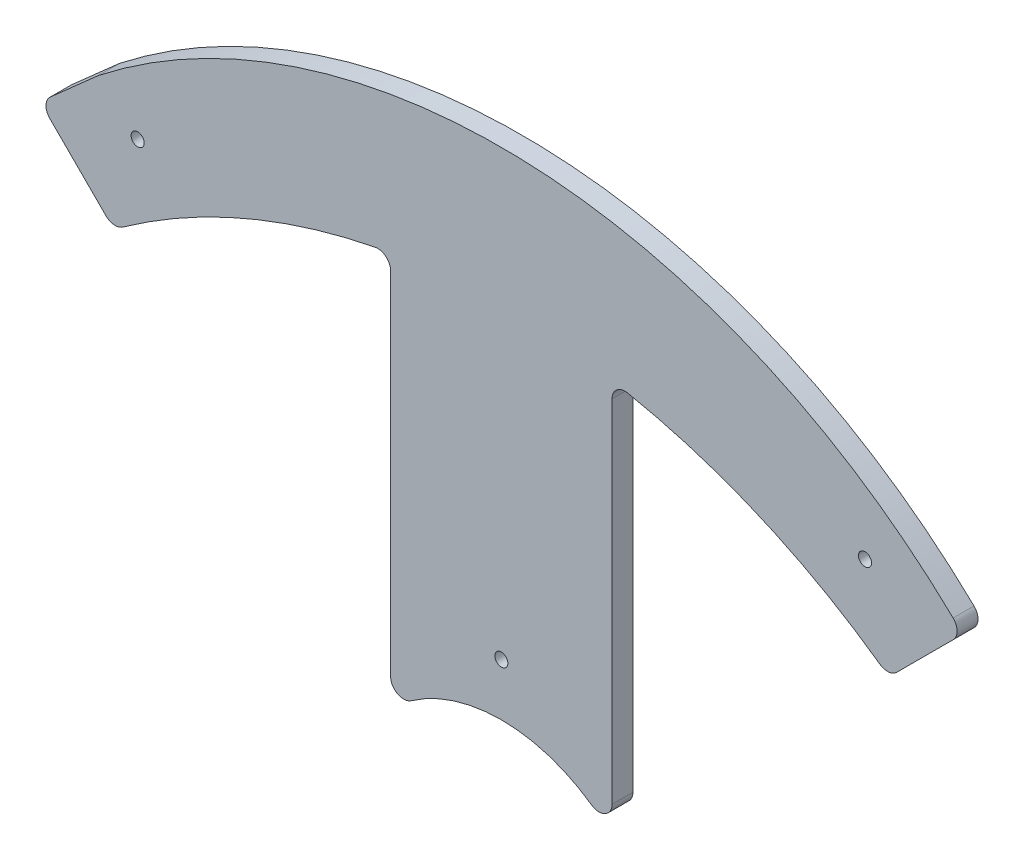
ISO-10303-21;
HEADER;
FILE_DESCRIPTION(('STEP AP214'),'2;1');
FILE_NAME('part.step','',(''),(''),'','','');
FILE_SCHEMA(('AUTOMOTIVE_DESIGN { 1 0 10303 214 1 1 1 1 }'));
ENDSEC;
DATA;
#1=APPLICATION_CONTEXT('core data for automotive mechanical design processes');
#2=APPLICATION_PROTOCOL_DEFINITION('international standard','automotive_design',2000,#1);
#3=PRODUCT_CONTEXT('',#1,'mechanical');
#4=PRODUCT('Part','Part','',(#3));
#5=PRODUCT_RELATED_PRODUCT_CATEGORY('part','',(#4));
#6=PRODUCT_DEFINITION_FORMATION('','',#4);
#7=PRODUCT_DEFINITION_CONTEXT('part definition',#1,'design');
#8=PRODUCT_DEFINITION('design','',#6,#7);
#9=PRODUCT_DEFINITION_SHAPE('','',#8);
#10=(LENGTH_UNIT() NAMED_UNIT(*) SI_UNIT(.MILLI.,.METRE.));
#11=(NAMED_UNIT(*) PLANE_ANGLE_UNIT() SI_UNIT($,.RADIAN.));
#12=(NAMED_UNIT(*) SI_UNIT($,.STERADIAN.) SOLID_ANGLE_UNIT());
#13=UNCERTAINTY_MEASURE_WITH_UNIT(LENGTH_MEASURE(1.E-05),#10,'distance_accuracy_value','');
#14=(GEOMETRIC_REPRESENTATION_CONTEXT(3) GLOBAL_UNCERTAINTY_ASSIGNED_CONTEXT((#13)) GLOBAL_UNIT_ASSIGNED_CONTEXT((#10,
#11,#12)) REPRESENTATION_CONTEXT('',''));
#15=CARTESIAN_POINT('',(0.,0.,0.));
#16=DIRECTION('',(0.,0.,1.));
#17=DIRECTION('',(1.,0.,0.));
#18=AXIS2_PLACEMENT_3D('',#15,#16,#17);
#19=CARTESIAN_POINT('',(-12.0713941023266,13.615382375672,4.));
#20=DIRECTION('',(-0.663406434529659,0.748259248272045,0.));
#21=DIRECTION('',(-0.748259248272045,-0.663406434529659,0.));
#22=AXIS2_PLACEMENT_3D('',#19,#20,#21);
#23=PLANE('',#22);
#24=DIRECTION('',(0.748259248272045,0.663406434529659,0.));
#25=VECTOR('',#24,1.);
#26=CARTESIAN_POINT('',(-12.0713941023266,13.615382375672,0.));
#27=LINE('',#26,#25);
#28=CARTESIAN_POINT('',(-109.042027409019,-72.3587532526346,0.));
#29=VERTEX_POINT('',#28);
#30=CARTESIAN_POINT('',(-99.8046045553056,-64.1688568046103,0.));
#31=VERTEX_POINT('',#30);
#32=EDGE_CURVE('E211',#29,#31,#27,.T.);
#33=ORIENTED_EDGE('',*,*,#32,.F.);
#34=DIRECTION('',(0.,0.,-1.));
#35=VECTOR('',#34,1.);
#36=CARTESIAN_POINT('',(-109.042027409019,-72.3587532526346,4.));
#37=LINE('',#36,#35);
#38=CARTESIAN_POINT('',(-109.042027409019,-72.3587532526346,4.));
#39=VERTEX_POINT('',#38);
#40=EDGE_CURVE('E166',#29,#39,#37,.F.);
#41=ORIENTED_EDGE('',*,*,#40,.T.);
#42=DIRECTION('',(0.748259248272045,0.663406434529659,0.));
#43=VECTOR('',#42,1.);
#44=CARTESIAN_POINT('',(-12.0713941023266,13.615382375672,4.));
#45=LINE('',#44,#43);
#46=CARTESIAN_POINT('',(-99.8046045553056,-64.1688568046103,4.));
#47=VERTEX_POINT('',#46);
#48=EDGE_CURVE('E160',#39,#47,#45,.T.);
#49=ORIENTED_EDGE('',*,*,#48,.T.);
#50=DIRECTION('',(0.,0.,-1.));
#51=VECTOR('',#50,1.);
#52=CARTESIAN_POINT('',(-99.8046045553056,-64.1688568046103,4.));
#53=LINE('',#52,#51);
#54=EDGE_CURVE('E163',#47,#31,#53,.T.);
#55=ORIENTED_EDGE('',*,*,#54,.T.);
#56=EDGE_LOOP('',(#33,#41,#49,#55));
#57=FACE_BOUND('',#56,.T.);
#58=ADVANCED_FACE('F40',(#57),#23,.T.);
#59=CARTESIAN_POINT('',(-92.5742233009708,-92.574223300971,4.));
#60=DIRECTION('',(0.707106781186547,0.707106781186548,0.));
#61=DIRECTION('',(-0.707106781186548,0.707106781186547,0.));
#62=AXIS2_PLACEMENT_3D('',#59,#60,#61);
#63=PLANE('',#62);
#64=DIRECTION('',(0.707106781186548,-0.707106781186547,0.));
#65=VECTOR('',#64,1.);
#66=CARTESIAN_POINT('',(-92.5742233009708,-92.574223300971,4.));
#67=LINE('',#66,#65);
#68=CARTESIAN_POINT('',(-109.151278275661,-75.9971683262811,4.));
#69=VERTEX_POINT('',#68);
#70=CARTESIAN_POINT('',(-98.397664583505,-86.7507820184369,4.));
#71=VERTEX_POINT('',#70);
#72=EDGE_CURVE('E171',#69,#71,#67,.T.);
#73=ORIENTED_EDGE('',*,*,#72,.F.);
#74=DIRECTION('',(0.,0.,-1.));
#75=VECTOR('',#74,1.);
#76=CARTESIAN_POINT('',(-109.151278275661,-75.9971683262811,0.));
#77=LINE('',#76,#75);
#78=CARTESIAN_POINT('',(-109.151278275661,-75.9971683262811,0.));
#79=VERTEX_POINT('',#78);
#80=EDGE_CURVE('E301',#69,#79,#77,.T.);
#81=ORIENTED_EDGE('',*,*,#80,.T.);
#82=DIRECTION('',(0.707106781186548,-0.707106781186547,0.));
#83=VECTOR('',#82,1.);
#84=CARTESIAN_POINT('',(-92.5742233009708,-92.574223300971,0.));
#85=LINE('',#84,#83);
#86=CARTESIAN_POINT('',(-98.397664583505,-86.7507820184369,0.));
#87=VERTEX_POINT('',#86);
#88=EDGE_CURVE('E214',#79,#87,#85,.T.);
#89=ORIENTED_EDGE('',*,*,#88,.T.);
#90=DIRECTION('',(0.,0.,1.));
#91=VECTOR('',#90,1.);
#92=CARTESIAN_POINT('',(-98.397664583505,-86.7507820184369,4.));
#93=LINE('',#92,#91);
#94=EDGE_CURVE('E298',#87,#71,#93,.T.);
#95=ORIENTED_EDGE('',*,*,#94,.T.);
#96=EDGE_LOOP('',(#73,#81,#89,#95));
#97=FACE_BOUND('',#96,.T.);
#98=ADVANCED_FACE('F372',(#97),#63,.F.);
#99=CARTESIAN_POINT('',(-22.6401456310679,-188.818300970874,4.));
#100=DIRECTION('',(0.,0.,-1.));
#101=DIRECTION('',(-1.,0.,0.));
#102=AXIS2_PLACEMENT_3D('',#99,#100,#101);
#103=CYLINDRICAL_SURFACE('',#102,125.);
#104=CARTESIAN_POINT('',(-22.6401456310679,-188.818300970874,0.));
#105=DIRECTION('',(0.,0.,1.));
#106=DIRECTION('',(1.,0.,0.));
#107=AXIS2_PLACEMENT_3D('',#104,#105,#106);
#108=CIRCLE('',#107,125.);
#109=CARTESIAN_POINT('',(-46.8372919939217,-66.1826694933353,0.));
#110=VERTEX_POINT('',#109);
#111=CARTESIAN_POINT('',(-95.1791181795686,-87.0190010636157,0.));
#112=VERTEX_POINT('',#111);
#113=EDGE_CURVE('E218',#110,#112,#108,.T.);
#114=ORIENTED_EDGE('',*,*,#113,.F.);
#115=DIRECTION('',(0.,0.,-1.));
#116=VECTOR('',#115,1.);
#117=CARTESIAN_POINT('',(-46.8372919939217,-66.1826694933353,4.));
#118=LINE('',#117,#116);
#119=CARTESIAN_POINT('',(-46.8372919939217,-66.1826694933353,4.));
#120=VERTEX_POINT('',#119);
#121=EDGE_CURVE('E328',#110,#120,#118,.F.);
#122=ORIENTED_EDGE('',*,*,#121,.T.);
#123=CARTESIAN_POINT('',(-22.6401456310679,-188.818300970874,4.));
#124=DIRECTION('',(0.,0.,1.));
#125=DIRECTION('',(1.,0.,0.));
#126=AXIS2_PLACEMENT_3D('',#123,#124,#125);
#127=CIRCLE('',#126,125.);
#128=CARTESIAN_POINT('',(-95.1791181795686,-87.0190010636157,4.));
#129=VERTEX_POINT('',#128);
#130=EDGE_CURVE('E375',#120,#129,#127,.T.);
#131=ORIENTED_EDGE('',*,*,#130,.T.);
#132=DIRECTION('',(0.,0.,-1.));
#133=VECTOR('',#132,1.);
#134=CARTESIAN_POINT('',(-95.1791181795685,-87.0190010636157,4.));
#135=LINE('',#134,#133);
#136=EDGE_CURVE('E320',#129,#112,#135,.T.);
#137=ORIENTED_EDGE('',*,*,#136,.T.);
#138=EDGE_LOOP('',(#114,#122,#131,#137));
#139=FACE_BOUND('',#138,.T.);
#140=ADVANCED_FACE('F408',(#139),#103,.F.);
#141=CARTESIAN_POINT('',(-43.8533490666648,-1.12606582089362E-13,4.));
#142=DIRECTION('',(-1.,0.,0.));
#143=DIRECTION('',(0.,-1.,0.));
#144=AXIS2_PLACEMENT_3D('',#141,#142,#143);
#145=PLANE('',#144);
#146=DIRECTION('',(0.,1.,0.));
#147=VECTOR('',#146,1.);
#148=CARTESIAN_POINT('',(-43.8533490666648,-1.12606582089362E-13,4.));
#149=LINE('',#148,#147);
#150=CARTESIAN_POINT('',(-43.8533490666644,-135.936398194106,4.));
#151=VERTEX_POINT('',#150);
#152=CARTESIAN_POINT('',(-43.8533490666646,-68.635382122886,4.));
#153=VERTEX_POINT('',#152);
#154=EDGE_CURVE('E378',#151,#153,#149,.T.);
#155=ORIENTED_EDGE('',*,*,#154,.T.);
#156=DIRECTION('',(0.,0.,1.));
#157=VECTOR('',#156,1.);
#158=CARTESIAN_POINT('',(-43.8533490666646,-68.635382122886,0.));
#159=LINE('',#158,#157);
#160=CARTESIAN_POINT('',(-43.8533490666646,-68.635382122886,0.));
#161=VERTEX_POINT('',#160);
#162=EDGE_CURVE('E324',#153,#161,#159,.F.);
#163=ORIENTED_EDGE('',*,*,#162,.T.);
#164=DIRECTION('',(0.,1.,0.));
#165=VECTOR('',#164,1.);
#166=CARTESIAN_POINT('',(-43.8533490666648,-1.12606582089362E-13,0.));
#167=LINE('',#166,#165);
#168=CARTESIAN_POINT('',(-43.8533490666644,-135.936398194106,0.));
#169=VERTEX_POINT('',#168);
#170=EDGE_CURVE('E221',#169,#161,#167,.T.);
#171=ORIENTED_EDGE('',*,*,#170,.F.);
#172=DIRECTION('',(0.,0.,-1.));
#173=VECTOR('',#172,1.);
#174=CARTESIAN_POINT('',(-43.8533490666644,-135.936398194106,4.));
#175=LINE('',#174,#173);
#176=EDGE_CURVE('E285',#169,#151,#175,.F.);
#177=ORIENTED_EDGE('',*,*,#176,.T.);
#178=EDGE_LOOP('',(#155,#163,#171,#177));
#179=FACE_BOUND('',#178,.T.);
#180=ADVANCED_FACE('F445',(#179),#145,.T.);
#181=CARTESIAN_POINT('',(-22.640145631068,-162.508300970874,4.));
#182=DIRECTION('',(0.,0.,-1.));
#183=DIRECTION('',(-1.,0.,0.));
#184=AXIS2_PLACEMENT_3D('',#181,#182,#183);
#185=CYLINDRICAL_SURFACE('',#184,30.);
#186=CARTESIAN_POINT('',(-22.640145631068,-162.508300970874,4.));
#187=DIRECTION('',(0.,0.,1.));
#188=DIRECTION('',(1.,0.,0.));
#189=AXIS2_PLACEMENT_3D('',#186,#187,#188);
#190=CIRCLE('',#189,30.);
#191=CARTESIAN_POINT('',(-5.36641938282519,-137.980390715396,4.));
#192=VERTEX_POINT('',#191);
#193=CARTESIAN_POINT('',(-39.9138718793108,-137.980390715396,4.));
#194=VERTEX_POINT('',#193);
#195=EDGE_CURVE('E385',#192,#194,#190,.T.);
#196=ORIENTED_EDGE('',*,*,#195,.T.);
#197=DIRECTION('',(0.,0.,-1.));
#198=VECTOR('',#197,1.);
#199=CARTESIAN_POINT('',(-39.9138718793108,-137.980390715396,4.));
#200=LINE('',#199,#198);
#201=CARTESIAN_POINT('',(-39.9138718793108,-137.980390715396,0.));
#202=VERTEX_POINT('',#201);
#203=EDGE_CURVE('E275',#194,#202,#200,.T.);
#204=ORIENTED_EDGE('',*,*,#203,.T.);
#205=CARTESIAN_POINT('',(-22.640145631068,-162.508300970874,0.));
#206=DIRECTION('',(0.,0.,1.));
#207=DIRECTION('',(1.,0.,0.));
#208=AXIS2_PLACEMENT_3D('',#205,#206,#207);
#209=CIRCLE('',#208,30.);
#210=CARTESIAN_POINT('',(-5.36641938282519,-137.980390715396,0.));
#211=VERTEX_POINT('',#210);
#212=EDGE_CURVE('E225',#211,#202,#209,.T.);
#213=ORIENTED_EDGE('',*,*,#212,.F.);
#214=DIRECTION('',(0.,0.,-1.));
#215=VECTOR('',#214,1.);
#216=CARTESIAN_POINT('',(-5.36641938282519,-137.980390715396,4.));
#217=LINE('',#216,#215);
#218=EDGE_CURVE('E272',#211,#192,#217,.F.);
#219=ORIENTED_EDGE('',*,*,#218,.T.);
#220=EDGE_LOOP('',(#196,#204,#213,#219));
#221=FACE_BOUND('',#220,.T.);
#222=ADVANCED_FACE('F452',(#221),#185,.F.);
#223=CARTESIAN_POINT('',(-1.42694219547189,0.,4.));
#224=DIRECTION('',(-1.,0.,0.));
#225=DIRECTION('',(0.,-1.,0.));
#226=AXIS2_PLACEMENT_3D('',#223,#224,#225);
#227=PLANE('',#226);
#228=DIRECTION('',(0.,1.,0.));
#229=VECTOR('',#228,1.);
#230=CARTESIAN_POINT('',(-1.42694219547189,0.,0.));
#231=LINE('',#230,#229);
#232=CARTESIAN_POINT('',(-1.42694219547163,-135.936398194106,0.));
#233=VERTEX_POINT('',#232);
#234=CARTESIAN_POINT('',(-1.42694219547176,-68.6353821228859,0.));
#235=VERTEX_POINT('',#234);
#236=EDGE_CURVE('E229',#233,#235,#231,.T.);
#237=ORIENTED_EDGE('',*,*,#236,.T.);
#238=DIRECTION('',(0.,0.,-1.));
#239=VECTOR('',#238,1.);
#240=CARTESIAN_POINT('',(-1.42694219547176,-68.6353821228859,4.));
#241=LINE('',#240,#239);
#242=CARTESIAN_POINT('',(-1.42694219547176,-68.6353821228859,4.));
#243=VERTEX_POINT('',#242);
#244=EDGE_CURVE('E62',#235,#243,#241,.F.);
#245=ORIENTED_EDGE('',*,*,#244,.T.);
#246=DIRECTION('',(0.,1.,0.));
#247=VECTOR('',#246,1.);
#248=CARTESIAN_POINT('',(-1.42694219547189,0.,4.));
#249=LINE('',#248,#247);
#250=CARTESIAN_POINT('',(-1.42694219547163,-135.936398194106,4.));
#251=VERTEX_POINT('',#250);
#252=EDGE_CURVE('E389',#251,#243,#249,.T.);
#253=ORIENTED_EDGE('',*,*,#252,.F.);
#254=DIRECTION('',(0.,0.,1.));
#255=VECTOR('',#254,1.);
#256=CARTESIAN_POINT('',(-1.42694219547163,-135.936398194106,0.));
#257=LINE('',#256,#255);
#258=EDGE_CURVE('E294',#251,#233,#257,.F.);
#259=ORIENTED_EDGE('',*,*,#258,.T.);
#260=EDGE_LOOP('',(#237,#245,#253,#259));
#261=FACE_BOUND('',#260,.T.);
#262=ADVANCED_FACE('F454',(#261),#227,.F.);
#263=CARTESIAN_POINT('',(-22.6401456310679,-188.818300970874,4.));
#264=DIRECTION('',(0.,0.,-1.));
#265=DIRECTION('',(-1.,0.,0.));
#266=AXIS2_PLACEMENT_3D('',#263,#264,#265);
#267=CYLINDRICAL_SURFACE('',#266,125.);
#268=CARTESIAN_POINT('',(-22.6401456310679,-188.818300970874,4.));
#269=DIRECTION('',(0.,0.,1.));
#270=DIRECTION('',(1.,0.,0.));
#271=AXIS2_PLACEMENT_3D('',#268,#269,#270);
#272=CIRCLE('',#271,125.);
#273=CARTESIAN_POINT('',(49.8988269174324,-87.0190010636155,4.));
#274=VERTEX_POINT('',#273);
#275=CARTESIAN_POINT('',(1.55700073178531,-66.1826694933352,4.));
#276=VERTEX_POINT('',#275);
#277=EDGE_CURVE('E200',#274,#276,#272,.T.);
#278=ORIENTED_EDGE('',*,*,#277,.T.);
#279=DIRECTION('',(0.,0.,-1.));
#280=VECTOR('',#279,1.);
#281=CARTESIAN_POINT('',(1.55700073178531,-66.1826694933352,4.));
#282=LINE('',#281,#280);
#283=CARTESIAN_POINT('',(1.55700073178531,-66.1826694933352,0.));
#284=VERTEX_POINT('',#283);
#285=EDGE_CURVE('E337',#276,#284,#282,.T.);
#286=ORIENTED_EDGE('',*,*,#285,.T.);
#287=CARTESIAN_POINT('',(-22.6401456310679,-188.818300970874,0.));
#288=DIRECTION('',(0.,0.,1.));
#289=DIRECTION('',(1.,0.,0.));
#290=AXIS2_PLACEMENT_3D('',#287,#288,#289);
#291=CIRCLE('',#290,125.);
#292=CARTESIAN_POINT('',(49.8988269174324,-87.0190010636155,0.));
#293=VERTEX_POINT('',#292);
#294=EDGE_CURVE('E232',#293,#284,#291,.T.);
#295=ORIENTED_EDGE('',*,*,#294,.F.);
#296=DIRECTION('',(0.,0.,-1.));
#297=VECTOR('',#296,1.);
#298=CARTESIAN_POINT('',(49.8988269174324,-87.0190010636155,4.));
#299=LINE('',#298,#297);
#300=EDGE_CURVE('E269',#293,#274,#299,.F.);
#301=ORIENTED_EDGE('',*,*,#300,.T.);
#302=EDGE_LOOP('',(#278,#286,#295,#301));
#303=FACE_BOUND('',#302,.T.);
#304=ADVANCED_FACE('F347',(#303),#267,.F.);
#305=CARTESIAN_POINT('',(69.9340776699029,-69.9340776699024,4.));
#306=DIRECTION('',(0.70710678118655,-0.707106781186545,0.));
#307=DIRECTION('',(0.707106781186545,0.70710678118655,0.));
#308=AXIS2_PLACEMENT_3D('',#305,#306,#307);
#309=PLANE('',#308);
#310=DIRECTION('',(-0.707106781186545,-0.70710678118655,0.));
#311=VECTOR('',#310,1.);
#312=CARTESIAN_POINT('',(69.9340776699029,-69.9340776699024,0.));
#313=LINE('',#312,#311);
#314=CARTESIAN_POINT('',(63.9623947473757,-75.9057605924297,0.));
#315=VERTEX_POINT('',#314);
#316=CARTESIAN_POINT('',(53.1173733213688,-86.7507820184367,0.));
#317=VERTEX_POINT('',#316);
#318=EDGE_CURVE('E235',#315,#317,#313,.T.);
#319=ORIENTED_EDGE('',*,*,#318,.F.);
#320=DIRECTION('',(0.,0.,-1.));
#321=VECTOR('',#320,1.);
#322=CARTESIAN_POINT('',(63.9623947473757,-75.9057605924297,4.));
#323=LINE('',#322,#321);
#324=CARTESIAN_POINT('',(63.9623947473757,-75.9057605924297,4.));
#325=VERTEX_POINT('',#324);
#326=EDGE_CURVE('E261',#315,#325,#323,.F.);
#327=ORIENTED_EDGE('',*,*,#326,.T.);
#328=DIRECTION('',(-0.707106781186545,-0.70710678118655,0.));
#329=VECTOR('',#328,1.);
#330=CARTESIAN_POINT('',(69.9340776699029,-69.9340776699024,4.));
#331=LINE('',#330,#329);
#332=CARTESIAN_POINT('',(53.1173733213688,-86.7507820184367,4.));
#333=VERTEX_POINT('',#332);
#334=EDGE_CURVE('E193',#325,#333,#331,.T.);
#335=ORIENTED_EDGE('',*,*,#334,.T.);
#336=DIRECTION('',(0.,0.,-1.));
#337=VECTOR('',#336,1.);
#338=CARTESIAN_POINT('',(53.1173733213688,-86.7507820184367,4.));
#339=LINE('',#338,#337);
#340=EDGE_CURVE('E257',#333,#317,#339,.T.);
#341=ORIENTED_EDGE('',*,*,#340,.T.);
#342=EDGE_LOOP('',(#319,#327,#335,#341));
#343=FACE_BOUND('',#342,.T.);
#344=ADVANCED_FACE('F361',(#343),#309,.T.);
#345=CARTESIAN_POINT('',(-92.3185492135133,-71.0210336917498,4.));
#346=DIRECTION('',(0.,0.,-1.));
#347=DIRECTION('',(-1.,0.,0.));
#348=AXIS2_PLACEMENT_3D('',#345,#346,#347);
#349=CYLINDRICAL_SURFACE('',#348,1.25);
#350=CARTESIAN_POINT('',(-92.3185492135133,-71.0210336917498,4.));
#351=DIRECTION('',(0.,0.,1.));
#352=DIRECTION('',(1.,0.,0.));
#353=AXIS2_PLACEMENT_3D('',#350,#351,#352);
#354=CIRCLE('',#353,1.25);
#355=CARTESIAN_POINT('',(-91.0685492135133,-71.0210336917498,4.));
#356=VERTEX_POINT('',#355);
#357=EDGE_CURVE('E192',#356,#356,#354,.T.);
#358=ORIENTED_EDGE('',*,*,#357,.T.);
#359=EDGE_LOOP('',(#358));
#360=FACE_BOUND('',#359,.T.);
#361=CARTESIAN_POINT('',(-92.3185492135133,-71.0210336917498,0.));
#362=DIRECTION('',(0.,0.,1.));
#363=DIRECTION('',(1.,0.,0.));
#364=AXIS2_PLACEMENT_3D('',#361,#362,#363);
#365=CIRCLE('',#364,1.25);
#366=CARTESIAN_POINT('',(-91.0685492135133,-71.0210336917498,0.));
#367=VERTEX_POINT('',#366);
#368=EDGE_CURVE('E241',#367,#367,#365,.T.);
#369=ORIENTED_EDGE('',*,*,#368,.F.);
#370=EDGE_LOOP('',(#369));
#371=FACE_BOUND('',#370,.T.);
#372=ADVANCED_FACE('F521',(#360,#371),#349,.F.);
#373=CARTESIAN_POINT('',(-22.640145631068,-162.508300970874,4.));
#374=DIRECTION('',(0.,0.,-1.));
#375=DIRECTION('',(-1.,0.,0.));
#376=AXIS2_PLACEMENT_3D('',#373,#374,#375);
#377=CYLINDRICAL_SURFACE('',#376,125.);
#378=CARTESIAN_POINT('',(-22.640145631068,-162.508300970874,4.));
#379=DIRECTION('',(0.,0.,1.));
#380=DIRECTION('',(1.,0.,0.));
#381=AXIS2_PLACEMENT_3D('',#378,#379,#380);
#382=CIRCLE('',#381,125.);
#383=CARTESIAN_POINT('',(63.9259497010517,-72.3345179796386,4.));
#384=VERTEX_POINT('',#383);
#385=EDGE_CURVE('E178',#47,#384,#382,.F.);
#386=ORIENTED_EDGE('',*,*,#385,.T.);
#387=DIRECTION('',(0.,0.,-1.));
#388=VECTOR('',#387,1.);
#389=CARTESIAN_POINT('',(63.9259497010517,-72.3345179796386,4.));
#390=LINE('',#389,#388);
#391=CARTESIAN_POINT('',(63.9259497010517,-72.3345179796386,0.));
#392=VERTEX_POINT('',#391);
#393=EDGE_CURVE('E183',#384,#392,#390,.T.);
#394=ORIENTED_EDGE('',*,*,#393,.T.);
#395=CARTESIAN_POINT('',(-22.640145631068,-162.508300970874,0.));
#396=DIRECTION('',(0.,0.,1.));
#397=DIRECTION('',(1.,0.,0.));
#398=AXIS2_PLACEMENT_3D('',#395,#396,#397);
#399=CIRCLE('',#398,125.);
#400=EDGE_CURVE('E181',#31,#392,#399,.F.);
#401=ORIENTED_EDGE('',*,*,#400,.F.);
#402=ORIENTED_EDGE('',*,*,#54,.F.);
#403=EDGE_LOOP('',(#386,#394,#401,#402));
#404=FACE_BOUND('',#403,.T.);
#405=ADVANCED_FACE('F176',(#404),#377,.T.);
#406=CARTESIAN_POINT('',(-22.640145631068,-122.508300970874,4.));
#407=DIRECTION('',(0.,0.,-1.));
#408=DIRECTION('',(-1.,0.,0.));
#409=AXIS2_PLACEMENT_3D('',#406,#407,#408);
#410=CYLINDRICAL_SURFACE('',#409,1.25);
#411=CARTESIAN_POINT('',(-22.640145631068,-122.508300970874,4.));
#412=DIRECTION('',(0.,0.,1.));
#413=DIRECTION('',(1.,0.,0.));
#414=AXIS2_PLACEMENT_3D('',#411,#412,#413);
#415=CIRCLE('',#414,1.25);
#416=CARTESIAN_POINT('',(-21.390145631068,-122.508300970874,4.));
#417=VERTEX_POINT('',#416);
#418=EDGE_CURVE('E172',#417,#417,#415,.T.);
#419=ORIENTED_EDGE('',*,*,#418,.T.);
#420=EDGE_LOOP('',(#419));
#421=FACE_BOUND('',#420,.T.);
#422=CARTESIAN_POINT('',(-22.640145631068,-122.508300970874,0.));
#423=DIRECTION('',(0.,0.,1.));
#424=DIRECTION('',(1.,0.,0.));
#425=AXIS2_PLACEMENT_3D('',#422,#423,#424);
#426=CIRCLE('',#425,1.25);
#427=CARTESIAN_POINT('',(-21.390145631068,-122.508300970874,0.));
#428=VERTEX_POINT('',#427);
#429=EDGE_CURVE('E207',#428,#428,#426,.T.);
#430=ORIENTED_EDGE('',*,*,#429,.F.);
#431=EDGE_LOOP('',(#430));
#432=FACE_BOUND('',#431,.T.);
#433=ADVANCED_FACE('F412',(#421,#432),#410,.F.);
#434=CARTESIAN_POINT('',(47.0382579513774,-71.0210336917498,4.));
#435=DIRECTION('',(0.,0.,-1.));
#436=DIRECTION('',(-1.,0.,0.));
#437=AXIS2_PLACEMENT_3D('',#434,#435,#436);
#438=CYLINDRICAL_SURFACE('',#437,1.25);
#439=CARTESIAN_POINT('',(47.0382579513774,-71.0210336917498,4.));
#440=DIRECTION('',(0.,0.,1.));
#441=DIRECTION('',(1.,0.,0.));
#442=AXIS2_PLACEMENT_3D('',#439,#440,#441);
#443=CIRCLE('',#442,1.25);
#444=CARTESIAN_POINT('',(48.2882579513774,-71.0210336917498,4.));
#445=VERTEX_POINT('',#444);
#446=EDGE_CURVE('E184',#445,#445,#443,.F.);
#447=ORIENTED_EDGE('',*,*,#446,.F.);
#448=EDGE_LOOP('',(#447));
#449=FACE_BOUND('',#448,.T.);
#450=CARTESIAN_POINT('',(47.0382579513774,-71.0210336917498,0.));
#451=DIRECTION('',(0.,0.,1.));
#452=DIRECTION('',(1.,0.,0.));
#453=AXIS2_PLACEMENT_3D('',#450,#451,#452);
#454=CIRCLE('',#453,1.25);
#455=CARTESIAN_POINT('',(48.2882579513774,-71.0210336917498,0.));
#456=VERTEX_POINT('',#455);
#457=EDGE_CURVE('E245',#456,#456,#454,.F.);
#458=ORIENTED_EDGE('',*,*,#457,.T.);
#459=EDGE_LOOP('',(#458));
#460=FACE_BOUND('',#459,.T.);
#461=ADVANCED_FACE('F415',(#449,#460),#438,.F.);
#462=CARTESIAN_POINT('',(0.,0.,4.));
#463=DIRECTION('',(0.,0.,1.));
#464=DIRECTION('',(1.,0.,0.));
#465=AXIS2_PLACEMENT_3D('',#462,#463,#464);
#466=PLANE('',#465);
#467=ORIENTED_EDGE('',*,*,#418,.F.);
#468=EDGE_LOOP('',(#467));
#469=FACE_BOUND('',#468,.T.);
#470=ORIENTED_EDGE('',*,*,#48,.F.);
#471=CARTESIAN_POINT('',(-107.383511322694,-74.2294013733147,4.));
#472=DIRECTION('',(0.,0.,1.));
#473=DIRECTION('',(1.,0.,0.));
#474=AXIS2_PLACEMENT_3D('',#471,#472,#473);
#475=CIRCLE('',#474,2.5);
#476=EDGE_CURVE('E317',#39,#69,#475,.T.);
#477=ORIENTED_EDGE('',*,*,#476,.T.);
#478=ORIENTED_EDGE('',*,*,#72,.T.);
#479=CARTESIAN_POINT('',(-96.6298976305386,-84.9830150654705,4.));
#480=DIRECTION('',(0.,0.,1.));
#481=DIRECTION('',(1.,0.,0.));
#482=AXIS2_PLACEMENT_3D('',#479,#480,#481);
#483=CIRCLE('',#482,2.5);
#484=EDGE_CURVE('E313',#71,#129,#483,.T.);
#485=ORIENTED_EDGE('',*,*,#484,.T.);
#486=ORIENTED_EDGE('',*,*,#130,.F.);
#487=CARTESIAN_POINT('',(-46.3533490666646,-68.635382122886,4.));
#488=DIRECTION('',(0.,0.,1.));
#489=DIRECTION('',(1.,0.,0.));
#490=AXIS2_PLACEMENT_3D('',#487,#488,#489);
#491=CIRCLE('',#490,2.5);
#492=EDGE_CURVE('E334',#120,#153,#491,.F.);
#493=ORIENTED_EDGE('',*,*,#492,.T.);
#494=ORIENTED_EDGE('',*,*,#154,.F.);
#495=CARTESIAN_POINT('',(-41.3533490666644,-135.936398194106,4.));
#496=DIRECTION('',(0.,0.,1.));
#497=DIRECTION('',(1.,0.,0.));
#498=AXIS2_PLACEMENT_3D('',#495,#496,#497);
#499=CIRCLE('',#498,2.5);
#500=EDGE_CURVE('E291',#151,#194,#499,.T.);
#501=ORIENTED_EDGE('',*,*,#500,.T.);
#502=ORIENTED_EDGE('',*,*,#195,.F.);
#503=CARTESIAN_POINT('',(-3.92694219547162,-135.936398194106,4.));
#504=DIRECTION('',(0.,0.,1.));
#505=DIRECTION('',(1.,0.,0.));
#506=AXIS2_PLACEMENT_3D('',#503,#504,#505);
#507=CIRCLE('',#506,2.5);
#508=EDGE_CURVE('E288',#192,#251,#507,.T.);
#509=ORIENTED_EDGE('',*,*,#508,.T.);
#510=ORIENTED_EDGE('',*,*,#252,.T.);
#511=CARTESIAN_POINT('',(1.07305780452824,-68.6353821228859,4.));
#512=DIRECTION('',(0.,0.,1.));
#513=DIRECTION('',(1.,0.,0.));
#514=AXIS2_PLACEMENT_3D('',#511,#512,#513);
#515=CIRCLE('',#514,2.5);
#516=EDGE_CURVE('E11',#243,#276,#515,.F.);
#517=ORIENTED_EDGE('',*,*,#516,.T.);
#518=ORIENTED_EDGE('',*,*,#277,.F.);
#519=CARTESIAN_POINT('',(51.3496063684024,-84.9830150654703,4.));
#520=DIRECTION('',(0.,0.,1.));
#521=DIRECTION('',(1.,0.,0.));
#522=AXIS2_PLACEMENT_3D('',#519,#520,#521);
#523=CIRCLE('',#522,2.5);
#524=EDGE_CURVE('E264',#274,#333,#523,.T.);
#525=ORIENTED_EDGE('',*,*,#524,.T.);
#526=ORIENTED_EDGE('',*,*,#334,.F.);
#527=CARTESIAN_POINT('',(62.1946277944093,-74.1379936394633,4.));
#528=DIRECTION('',(0.,0.,1.));
#529=DIRECTION('',(1.,0.,0.));
#530=AXIS2_PLACEMENT_3D('',#527,#528,#529);
#531=CIRCLE('',#530,2.5);
#532=EDGE_CURVE('E190',#325,#384,#531,.T.);
#533=ORIENTED_EDGE('',*,*,#532,.T.);
#534=ORIENTED_EDGE('',*,*,#385,.F.);
#535=EDGE_LOOP('',(#470,#477,#478,#485,#486,#493,#494,#501,#502,#509,#510,#517,#518,#525,#526,
#533,#534));
#536=FACE_BOUND('',#535,.T.);
#537=ORIENTED_EDGE('',*,*,#357,.F.);
#538=EDGE_LOOP('',(#537));
#539=FACE_BOUND('',#538,.T.);
#540=ORIENTED_EDGE('',*,*,#446,.T.);
#541=EDGE_LOOP('',(#540));
#542=FACE_BOUND('',#541,.T.);
#543=ADVANCED_FACE('F186',(#469,#536,#539,#542),#466,.T.);
#544=CARTESIAN_POINT('',(0.,0.,0.));
#545=DIRECTION('',(0.,0.,1.));
#546=DIRECTION('',(1.,0.,0.));
#547=AXIS2_PLACEMENT_3D('',#544,#545,#546);
#548=PLANE('',#547);
#549=ORIENTED_EDGE('',*,*,#429,.T.);
#550=EDGE_LOOP('',(#549));
#551=FACE_BOUND('',#550,.T.);
#552=ORIENTED_EDGE('',*,*,#88,.F.);
#553=CARTESIAN_POINT('',(-107.383511322694,-74.2294013733147,0.));
#554=DIRECTION('',(0.,0.,1.));
#555=DIRECTION('',(1.,0.,0.));
#556=AXIS2_PLACEMENT_3D('',#553,#554,#555);
#557=CIRCLE('',#556,2.5);
#558=EDGE_CURVE('E308',#79,#29,#557,.F.);
#559=ORIENTED_EDGE('',*,*,#558,.T.);
#560=ORIENTED_EDGE('',*,*,#32,.T.);
#561=ORIENTED_EDGE('',*,*,#400,.T.);
#562=CARTESIAN_POINT('',(62.1946277944093,-74.1379936394633,0.));
#563=DIRECTION('',(0.,0.,1.));
#564=DIRECTION('',(1.,0.,0.));
#565=AXIS2_PLACEMENT_3D('',#562,#563,#564);
#566=CIRCLE('',#565,2.5);
#567=EDGE_CURVE('E254',#392,#315,#566,.F.);
#568=ORIENTED_EDGE('',*,*,#567,.T.);
#569=ORIENTED_EDGE('',*,*,#318,.T.);
#570=CARTESIAN_POINT('',(51.3496063684024,-84.9830150654703,0.));
#571=DIRECTION('',(0.,0.,1.));
#572=DIRECTION('',(1.,0.,0.));
#573=AXIS2_PLACEMENT_3D('',#570,#571,#572);
#574=CIRCLE('',#573,2.5);
#575=EDGE_CURVE('E251',#317,#293,#574,.F.);
#576=ORIENTED_EDGE('',*,*,#575,.T.);
#577=ORIENTED_EDGE('',*,*,#294,.T.);
#578=CARTESIAN_POINT('',(1.07305780452824,-68.6353821228859,0.));
#579=DIRECTION('',(0.,0.,1.));
#580=DIRECTION('',(1.,0.,0.));
#581=AXIS2_PLACEMENT_3D('',#578,#579,#580);
#582=CIRCLE('',#581,2.5);
#583=EDGE_CURVE('E49',#284,#235,#582,.T.);
#584=ORIENTED_EDGE('',*,*,#583,.T.);
#585=ORIENTED_EDGE('',*,*,#236,.F.);
#586=CARTESIAN_POINT('',(-3.92694219547162,-135.936398194106,0.));
#587=DIRECTION('',(0.,0.,1.));
#588=DIRECTION('',(1.,0.,0.));
#589=AXIS2_PLACEMENT_3D('',#586,#587,#588);
#590=CIRCLE('',#589,2.5);
#591=EDGE_CURVE('E279',#233,#211,#590,.F.);
#592=ORIENTED_EDGE('',*,*,#591,.T.);
#593=ORIENTED_EDGE('',*,*,#212,.T.);
#594=CARTESIAN_POINT('',(-41.3533490666644,-135.936398194106,0.));
#595=DIRECTION('',(0.,0.,1.));
#596=DIRECTION('',(1.,0.,0.));
#597=AXIS2_PLACEMENT_3D('',#594,#595,#596);
#598=CIRCLE('',#597,2.5);
#599=EDGE_CURVE('E282',#202,#169,#598,.F.);
#600=ORIENTED_EDGE('',*,*,#599,.T.);
#601=ORIENTED_EDGE('',*,*,#170,.T.);
#602=CARTESIAN_POINT('',(-46.3533490666646,-68.635382122886,0.));
#603=DIRECTION('',(0.,0.,1.));
#604=DIRECTION('',(1.,0.,0.));
#605=AXIS2_PLACEMENT_3D('',#602,#603,#604);
#606=CIRCLE('',#605,2.5);
#607=EDGE_CURVE('E331',#161,#110,#606,.T.);
#608=ORIENTED_EDGE('',*,*,#607,.T.);
#609=ORIENTED_EDGE('',*,*,#113,.T.);
#610=CARTESIAN_POINT('',(-96.6298976305386,-84.9830150654705,0.));
#611=DIRECTION('',(0.,0.,1.));
#612=DIRECTION('',(1.,0.,0.));
#613=AXIS2_PLACEMENT_3D('',#610,#611,#612);
#614=CIRCLE('',#613,2.5);
#615=EDGE_CURVE('E305',#112,#87,#614,.F.);
#616=ORIENTED_EDGE('',*,*,#615,.T.);
#617=EDGE_LOOP('',(#552,#559,#560,#561,#568,#569,#576,#577,#584,#585,#592,#593,#600,#601,#608,
#609,#616));
#618=FACE_BOUND('',#617,.T.);
#619=ORIENTED_EDGE('',*,*,#368,.T.);
#620=EDGE_LOOP('',(#619));
#621=FACE_BOUND('',#620,.T.);
#622=ORIENTED_EDGE('',*,*,#457,.F.);
#623=EDGE_LOOP('',(#622));
#624=FACE_BOUND('',#623,.T.);
#625=ADVANCED_FACE('F353',(#551,#618,#621,#624),#548,.F.);
#626=CARTESIAN_POINT('',(62.1946277944093,-74.1379936394633,4.));
#627=DIRECTION('',(0.,0.,-1.));
#628=DIRECTION('',(-1.,0.,0.));
#629=AXIS2_PLACEMENT_3D('',#626,#627,#628);
#630=CYLINDRICAL_SURFACE('',#629,2.5);
#631=ORIENTED_EDGE('',*,*,#532,.F.);
#632=ORIENTED_EDGE('',*,*,#326,.F.);
#633=ORIENTED_EDGE('',*,*,#567,.F.);
#634=ORIENTED_EDGE('',*,*,#393,.F.);
#635=EDGE_LOOP('',(#631,#632,#633,#634));
#636=FACE_BOUND('',#635,.T.);
#637=ADVANCED_FACE('F364',(#636),#630,.T.);
#638=CARTESIAN_POINT('',(51.3496063684024,-84.9830150654703,4.));
#639=DIRECTION('',(0.,0.,-1.));
#640=DIRECTION('',(-1.,0.,0.));
#641=AXIS2_PLACEMENT_3D('',#638,#639,#640);
#642=CYLINDRICAL_SURFACE('',#641,2.5);
#643=ORIENTED_EDGE('',*,*,#524,.F.);
#644=ORIENTED_EDGE('',*,*,#300,.F.);
#645=ORIENTED_EDGE('',*,*,#575,.F.);
#646=ORIENTED_EDGE('',*,*,#340,.F.);
#647=EDGE_LOOP('',(#643,#644,#645,#646));
#648=FACE_BOUND('',#647,.T.);
#649=ADVANCED_FACE('F359',(#648),#642,.T.);
#650=CARTESIAN_POINT('',(-41.3533490666644,-135.936398194106,4.));
#651=DIRECTION('',(0.,0.,-1.));
#652=DIRECTION('',(-1.,0.,0.));
#653=AXIS2_PLACEMENT_3D('',#650,#651,#652);
#654=CYLINDRICAL_SURFACE('',#653,2.5);
#655=ORIENTED_EDGE('',*,*,#500,.F.);
#656=ORIENTED_EDGE('',*,*,#176,.F.);
#657=ORIENTED_EDGE('',*,*,#599,.F.);
#658=ORIENTED_EDGE('',*,*,#203,.F.);
#659=EDGE_LOOP('',(#655,#656,#657,#658));
#660=FACE_BOUND('',#659,.T.);
#661=ADVANCED_FACE('F421',(#660),#654,.T.);
#662=CARTESIAN_POINT('',(-3.92694219547162,-135.936398194106,4.));
#663=DIRECTION('',(0.,0.,-1.));
#664=DIRECTION('',(-1.,0.,0.));
#665=AXIS2_PLACEMENT_3D('',#662,#663,#664);
#666=CYLINDRICAL_SURFACE('',#665,2.5);
#667=ORIENTED_EDGE('',*,*,#508,.F.);
#668=ORIENTED_EDGE('',*,*,#218,.F.);
#669=ORIENTED_EDGE('',*,*,#591,.F.);
#670=ORIENTED_EDGE('',*,*,#258,.F.);
#671=EDGE_LOOP('',(#667,#668,#669,#670));
#672=FACE_BOUND('',#671,.T.);
#673=ADVANCED_FACE('F424',(#672),#666,.T.);
#674=CARTESIAN_POINT('',(-107.383511322694,-74.2294013733147,4.));
#675=DIRECTION('',(0.,0.,1.));
#676=DIRECTION('',(1.,0.,0.));
#677=AXIS2_PLACEMENT_3D('',#674,#675,#676);
#678=CYLINDRICAL_SURFACE('',#677,2.5);
#679=ORIENTED_EDGE('',*,*,#476,.F.);
#680=ORIENTED_EDGE('',*,*,#40,.F.);
#681=ORIENTED_EDGE('',*,*,#558,.F.);
#682=ORIENTED_EDGE('',*,*,#80,.F.);
#683=EDGE_LOOP('',(#679,#680,#681,#682));
#684=FACE_BOUND('',#683,.T.);
#685=ADVANCED_FACE('F366',(#684),#678,.T.);
#686=CARTESIAN_POINT('',(-96.6298976305386,-84.9830150654705,4.));
#687=DIRECTION('',(0.,0.,-1.));
#688=DIRECTION('',(-1.,0.,0.));
#689=AXIS2_PLACEMENT_3D('',#686,#687,#688);
#690=CYLINDRICAL_SURFACE('',#689,2.5);
#691=ORIENTED_EDGE('',*,*,#484,.F.);
#692=ORIENTED_EDGE('',*,*,#94,.F.);
#693=ORIENTED_EDGE('',*,*,#615,.F.);
#694=ORIENTED_EDGE('',*,*,#136,.F.);
#695=EDGE_LOOP('',(#691,#692,#693,#694));
#696=FACE_BOUND('',#695,.T.);
#697=ADVANCED_FACE('F400',(#696),#690,.T.);
#698=CARTESIAN_POINT('',(-46.3533490666646,-68.635382122886,4.));
#699=DIRECTION('',(0.,0.,-1.));
#700=DIRECTION('',(-1.,0.,0.));
#701=AXIS2_PLACEMENT_3D('',#698,#699,#700);
#702=CYLINDRICAL_SURFACE('',#701,2.5);
#703=ORIENTED_EDGE('',*,*,#492,.F.);
#704=ORIENTED_EDGE('',*,*,#121,.F.);
#705=ORIENTED_EDGE('',*,*,#607,.F.);
#706=ORIENTED_EDGE('',*,*,#162,.F.);
#707=EDGE_LOOP('',(#703,#704,#705,#706));
#708=FACE_BOUND('',#707,.T.);
#709=ADVANCED_FACE('F396',(#708),#702,.F.);
#710=CARTESIAN_POINT('',(1.07305780452824,-68.6353821228859,4.));
#711=DIRECTION('',(0.,0.,-1.));
#712=DIRECTION('',(-1.,0.,0.));
#713=AXIS2_PLACEMENT_3D('',#710,#711,#712);
#714=CYLINDRICAL_SURFACE('',#713,2.5);
#715=ORIENTED_EDGE('',*,*,#516,.F.);
#716=ORIENTED_EDGE('',*,*,#244,.F.);
#717=ORIENTED_EDGE('',*,*,#583,.F.);
#718=ORIENTED_EDGE('',*,*,#285,.F.);
#719=EDGE_LOOP('',(#715,#716,#717,#718));
#720=FACE_BOUND('',#719,.T.);
#721=ADVANCED_FACE('F42',(#720),#714,.F.);
#722=CLOSED_SHELL('',(#58,#98,#140,#180,#222,#262,#304,#344,#372,#405,#433,#461,#543,#625,#637,
#649,#661,#673,#685,#697,#709,#721));
#723=MANIFOLD_SOLID_BREP('B2',#722);
#724=ADVANCED_BREP_SHAPE_REPRESENTATION('',(#18,#723),#14);
#725=SHAPE_DEFINITION_REPRESENTATION(#9,#724);
ENDSEC;
END-ISO-10303-21;
